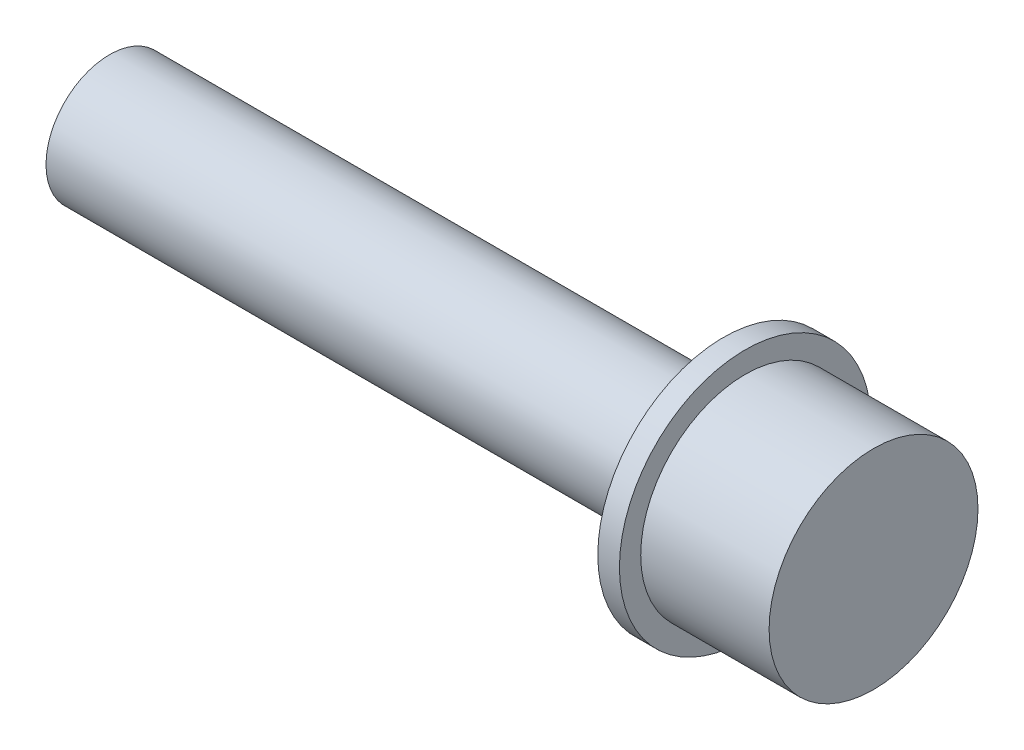
ISO-10303-21;
HEADER;
FILE_DESCRIPTION(('STEP AP214'),'2;1');
FILE_NAME('part.step','',(''),(''),'','','');
FILE_SCHEMA(('AUTOMOTIVE_DESIGN { 1 0 10303 214 1 1 1 1 }'));
ENDSEC;
DATA;
#1=APPLICATION_CONTEXT('core data for automotive mechanical design processes');
#2=APPLICATION_PROTOCOL_DEFINITION('international standard','automotive_design',2000,#1);
#3=PRODUCT_CONTEXT('',#1,'mechanical');
#4=PRODUCT('Part','Part','',(#3));
#5=PRODUCT_RELATED_PRODUCT_CATEGORY('part','',(#4));
#6=PRODUCT_DEFINITION_FORMATION('','',#4);
#7=PRODUCT_DEFINITION_CONTEXT('part definition',#1,'design');
#8=PRODUCT_DEFINITION('design','',#6,#7);
#9=PRODUCT_DEFINITION_SHAPE('','',#8);
#10=(LENGTH_UNIT() NAMED_UNIT(*) SI_UNIT(.MILLI.,.METRE.));
#11=(NAMED_UNIT(*) PLANE_ANGLE_UNIT() SI_UNIT($,.RADIAN.));
#12=(NAMED_UNIT(*) SI_UNIT($,.STERADIAN.) SOLID_ANGLE_UNIT());
#13=UNCERTAINTY_MEASURE_WITH_UNIT(LENGTH_MEASURE(1.E-05),#10,'distance_accuracy_value','');
#14=(GEOMETRIC_REPRESENTATION_CONTEXT(3) GLOBAL_UNCERTAINTY_ASSIGNED_CONTEXT((#13)) GLOBAL_UNIT_ASSIGNED_CONTEXT((#10,
#11,#12)) REPRESENTATION_CONTEXT('',''));
#15=CARTESIAN_POINT('',(0.,0.,0.));
#16=DIRECTION('',(0.,0.,1.));
#17=DIRECTION('',(1.,0.,0.));
#18=AXIS2_PLACEMENT_3D('',#15,#16,#17);
#19=CARTESIAN_POINT('',(6.06,0.,0.));
#20=DIRECTION('',(-1.,0.,0.));
#21=DIRECTION('',(0.,0.,1.));
#22=AXIS2_PLACEMENT_3D('',#19,#20,#21);
#23=CYLINDRICAL_SURFACE('',#22,4.93);
#24=CARTESIAN_POINT('',(6.06,0.,0.));
#25=DIRECTION('',(1.,0.,0.));
#26=DIRECTION('',(0.,0.,-1.));
#27=AXIS2_PLACEMENT_3D('',#24,#25,#26);
#28=CIRCLE('',#27,4.93);
#29=CARTESIAN_POINT('',(6.06,0.,-4.93));
#30=VERTEX_POINT('',#29);
#31=EDGE_CURVE('E10',#30,#30,#28,.T.);
#32=ORIENTED_EDGE('',*,*,#31,.F.);
#33=EDGE_LOOP('',(#32));
#34=FACE_BOUND('',#33,.T.);
#35=CARTESIAN_POINT('',(0.,0.,0.));
#36=DIRECTION('',(-1.,0.,0.));
#37=DIRECTION('',(0.,0.,1.));
#38=AXIS2_PLACEMENT_3D('',#35,#36,#37);
#39=CIRCLE('',#38,4.93);
#40=CARTESIAN_POINT('',(0.,0.,4.93));
#41=VERTEX_POINT('',#40);
#42=EDGE_CURVE('E50',#41,#41,#39,.T.);
#43=ORIENTED_EDGE('',*,*,#42,.F.);
#44=EDGE_LOOP('',(#43));
#45=FACE_BOUND('',#44,.T.);
#46=ADVANCED_FACE('F37',(#34,#45),#23,.T.);
#47=CARTESIAN_POINT('',(6.06,0.,0.));
#48=DIRECTION('',(1.,0.,0.));
#49=DIRECTION('',(0.,0.,-1.));
#50=AXIS2_PLACEMENT_3D('',#47,#48,#49);
#51=PLANE('',#50);
#52=ORIENTED_EDGE('',*,*,#31,.T.);
#53=EDGE_LOOP('',(#52));
#54=FACE_BOUND('',#53,.T.);
#55=ADVANCED_FACE('F65',(#54),#51,.T.);
#56=CARTESIAN_POINT('',(-1.02,0.,0.));
#57=DIRECTION('',(1.,0.,0.));
#58=DIRECTION('',(0.,0.,-1.));
#59=AXIS2_PLACEMENT_3D('',#56,#57,#58);
#60=CYLINDRICAL_SURFACE('',#59,5.935);
#61=CARTESIAN_POINT('',(-1.02,0.,0.));
#62=DIRECTION('',(-1.,0.,0.));
#63=DIRECTION('',(0.,0.,1.));
#64=AXIS2_PLACEMENT_3D('',#61,#62,#63);
#65=CIRCLE('',#64,5.935);
#66=CARTESIAN_POINT('',(-1.02,0.,5.935));
#67=VERTEX_POINT('',#66);
#68=EDGE_CURVE('E53',#67,#67,#65,.T.);
#69=ORIENTED_EDGE('',*,*,#68,.F.);
#70=EDGE_LOOP('',(#69));
#71=FACE_BOUND('',#70,.T.);
#72=CARTESIAN_POINT('',(0.,0.,0.));
#73=DIRECTION('',(-1.,0.,0.));
#74=DIRECTION('',(0.,0.,1.));
#75=AXIS2_PLACEMENT_3D('',#72,#73,#74);
#76=CIRCLE('',#75,5.935);
#77=CARTESIAN_POINT('',(0.,0.,5.935));
#78=VERTEX_POINT('',#77);
#79=EDGE_CURVE('E54',#78,#78,#76,.T.);
#80=ORIENTED_EDGE('',*,*,#79,.T.);
#81=EDGE_LOOP('',(#80));
#82=FACE_BOUND('',#81,.T.);
#83=ADVANCED_FACE('F62',(#71,#82),#60,.T.);
#84=CARTESIAN_POINT('',(-1.02,0.,0.));
#85=DIRECTION('',(-1.,0.,0.));
#86=DIRECTION('',(0.,0.,1.));
#87=AXIS2_PLACEMENT_3D('',#84,#85,#86);
#88=PLANE('',#87);
#89=CARTESIAN_POINT('',(-1.02,0.,0.));
#90=DIRECTION('',(-1.,0.,0.));
#91=DIRECTION('',(0.,0.,1.));
#92=AXIS2_PLACEMENT_3D('',#89,#90,#91);
#93=CIRCLE('',#92,3.);
#94=CARTESIAN_POINT('',(-1.02,0.,3.));
#95=VERTEX_POINT('',#94);
#96=EDGE_CURVE('E40',#95,#95,#93,.T.);
#97=ORIENTED_EDGE('',*,*,#96,.F.);
#98=EDGE_LOOP('',(#97));
#99=FACE_BOUND('',#98,.T.);
#100=ORIENTED_EDGE('',*,*,#68,.T.);
#101=EDGE_LOOP('',(#100));
#102=FACE_BOUND('',#101,.T.);
#103=ADVANCED_FACE('F60',(#99,#102),#88,.T.);
#104=CARTESIAN_POINT('',(0.,0.,0.));
#105=DIRECTION('',(-1.,0.,0.));
#106=DIRECTION('',(0.,0.,1.));
#107=AXIS2_PLACEMENT_3D('',#104,#105,#106);
#108=PLANE('',#107);
#109=ORIENTED_EDGE('',*,*,#42,.T.);
#110=EDGE_LOOP('',(#109));
#111=FACE_BOUND('',#110,.T.);
#112=ORIENTED_EDGE('',*,*,#79,.F.);
#113=EDGE_LOOP('',(#112));
#114=FACE_BOUND('',#113,.T.);
#115=ADVANCED_FACE('F69',(#111,#114),#108,.F.);
#116=CARTESIAN_POINT('',(-30.,0.,0.));
#117=DIRECTION('',(-1.,0.,0.));
#118=DIRECTION('',(0.,0.,1.));
#119=AXIS2_PLACEMENT_3D('',#116,#117,#118);
#120=PLANE('',#119);
#121=CARTESIAN_POINT('',(-30.,0.,0.));
#122=DIRECTION('',(-1.,0.,0.));
#123=DIRECTION('',(0.,0.,1.));
#124=AXIS2_PLACEMENT_3D('',#121,#122,#123);
#125=CIRCLE('',#124,3.);
#126=CARTESIAN_POINT('',(-30.,0.,3.));
#127=VERTEX_POINT('',#126);
#128=EDGE_CURVE('E44',#127,#127,#125,.T.);
#129=ORIENTED_EDGE('',*,*,#128,.T.);
#130=EDGE_LOOP('',(#129));
#131=FACE_BOUND('',#130,.T.);
#132=ADVANCED_FACE('F71',(#131),#120,.T.);
#133=CARTESIAN_POINT('',(-30.,0.,0.));
#134=DIRECTION('',(1.,0.,0.));
#135=DIRECTION('',(0.,0.,-1.));
#136=AXIS2_PLACEMENT_3D('',#133,#134,#135);
#137=CYLINDRICAL_SURFACE('',#136,3.);
#138=ORIENTED_EDGE('',*,*,#96,.T.);
#139=EDGE_LOOP('',(#138));
#140=FACE_BOUND('',#139,.T.);
#141=ORIENTED_EDGE('',*,*,#128,.F.);
#142=EDGE_LOOP('',(#141));
#143=FACE_BOUND('',#142,.T.);
#144=ADVANCED_FACE('F79',(#140,#143),#137,.T.);
#145=CLOSED_SHELL('',(#46,#55,#83,#103,#115,#132,#144));
#146=MANIFOLD_SOLID_BREP('B2',#145);
#147=ADVANCED_BREP_SHAPE_REPRESENTATION('',(#18,#146),#14);
#148=SHAPE_DEFINITION_REPRESENTATION(#9,#147);
ENDSEC;
END-ISO-10303-21;
